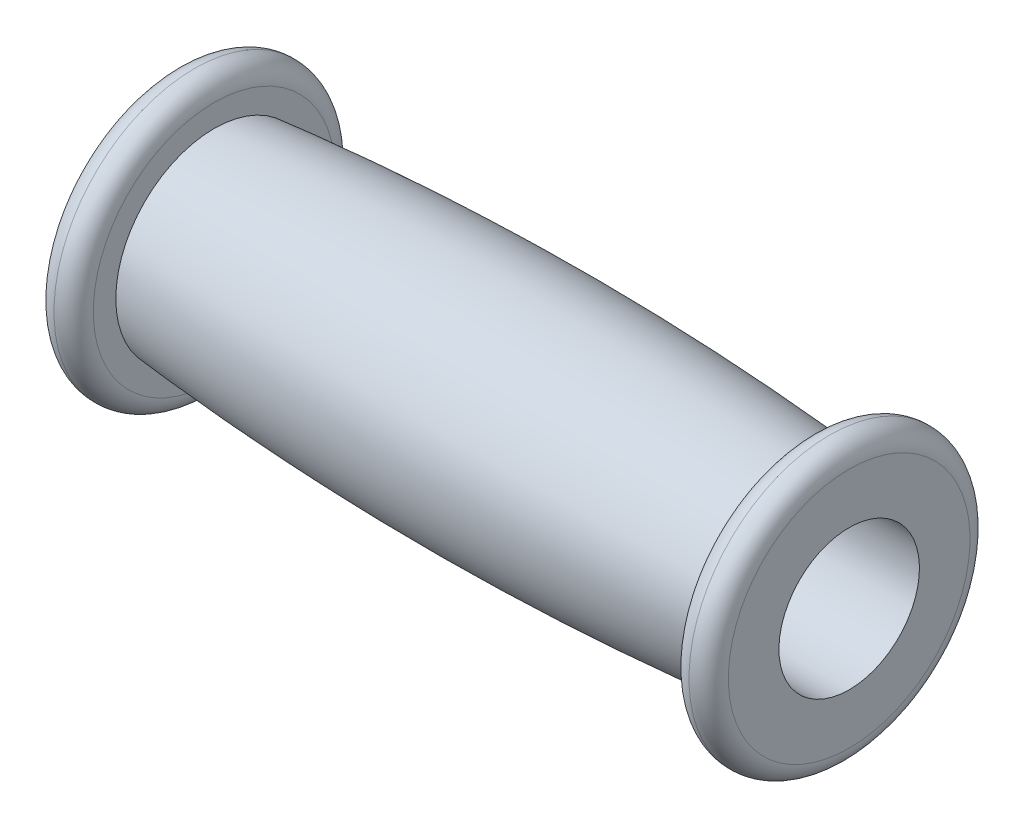
ISO-10303-21;
HEADER;
FILE_DESCRIPTION(('STEP AP214'),'2;1');
FILE_NAME('part.step','',(''),(''),'','','');
FILE_SCHEMA(('AUTOMOTIVE_DESIGN { 1 0 10303 214 1 1 1 1 }'));
ENDSEC;
DATA;
#1=APPLICATION_CONTEXT('core data for automotive mechanical design processes');
#2=APPLICATION_PROTOCOL_DEFINITION('international standard','automotive_design',2000,#1);
#3=PRODUCT_CONTEXT('',#1,'mechanical');
#4=PRODUCT('Part','Part','',(#3));
#5=PRODUCT_RELATED_PRODUCT_CATEGORY('part','',(#4));
#6=PRODUCT_DEFINITION_FORMATION('','',#4);
#7=PRODUCT_DEFINITION_CONTEXT('part definition',#1,'design');
#8=PRODUCT_DEFINITION('design','',#6,#7);
#9=PRODUCT_DEFINITION_SHAPE('','',#8);
#10=(LENGTH_UNIT() NAMED_UNIT(*) SI_UNIT(.MILLI.,.METRE.));
#11=(NAMED_UNIT(*) PLANE_ANGLE_UNIT() SI_UNIT($,.RADIAN.));
#12=(NAMED_UNIT(*) SI_UNIT($,.STERADIAN.) SOLID_ANGLE_UNIT());
#13=UNCERTAINTY_MEASURE_WITH_UNIT(LENGTH_MEASURE(1.E-05),#10,'distance_accuracy_value','');
#14=(GEOMETRIC_REPRESENTATION_CONTEXT(3) GLOBAL_UNCERTAINTY_ASSIGNED_CONTEXT((#13)) GLOBAL_UNIT_ASSIGNED_CONTEXT((#10,
#11,#12)) REPRESENTATION_CONTEXT('',''));
#15=CARTESIAN_POINT('',(0.,0.,0.));
#16=DIRECTION('',(0.,0.,1.));
#17=DIRECTION('',(1.,0.,0.));
#18=AXIS2_PLACEMENT_3D('',#15,#16,#17);
#19=CARTESIAN_POINT('',(120.,25.,0.));
#20=DIRECTION('',(1.,0.,0.));
#21=DIRECTION('',(0.,1.,0.));
#22=AXIS2_PLACEMENT_3D('',#19,#20,#21);
#23=PLANE('',#22);
#24=CARTESIAN_POINT('',(120.,0.,0.));
#25=DIRECTION('',(1.,0.,0.));
#26=DIRECTION('',(0.,1.,0.));
#27=AXIS2_PLACEMENT_3D('',#24,#25,#26);
#28=CIRCLE('',#27,21.5);
#29=CARTESIAN_POINT('',(120.,21.5,0.));
#30=VERTEX_POINT('',#29);
#31=EDGE_CURVE('E108',#30,#30,#28,.T.);
#32=ORIENTED_EDGE('',*,*,#31,.T.);
#33=EDGE_LOOP('',(#32));
#34=FACE_BOUND('',#33,.T.);
#35=CARTESIAN_POINT('',(120.,0.,0.));
#36=DIRECTION('',(-1.,0.,0.));
#37=DIRECTION('',(0.,-1.,0.));
#38=AXIS2_PLACEMENT_3D('',#35,#36,#37);
#39=CIRCLE('',#38,12.5);
#40=CARTESIAN_POINT('',(120.,-12.5,0.));
#41=VERTEX_POINT('',#40);
#42=EDGE_CURVE('E64',#41,#41,#39,.T.);
#43=ORIENTED_EDGE('',*,*,#42,.T.);
#44=EDGE_LOOP('',(#43));
#45=FACE_BOUND('',#44,.T.);
#46=ADVANCED_FACE('F37',(#34,#45),#23,.T.);
#47=CARTESIAN_POINT('',(113.,17.5,0.));
#48=DIRECTION('',(-1.,0.,0.));
#49=DIRECTION('',(0.,-1.,0.));
#50=AXIS2_PLACEMENT_3D('',#47,#48,#49);
#51=PLANE('',#50);
#52=CARTESIAN_POINT('',(113.,0.,0.));
#53=DIRECTION('',(-1.,0.,0.));
#54=DIRECTION('',(0.,-1.,0.));
#55=AXIS2_PLACEMENT_3D('',#52,#53,#54);
#56=CIRCLE('',#55,21.5);
#57=CARTESIAN_POINT('',(113.,-21.5,0.));
#58=VERTEX_POINT('',#57);
#59=EDGE_CURVE('E52',#58,#58,#56,.T.);
#60=ORIENTED_EDGE('',*,*,#59,.T.);
#61=EDGE_LOOP('',(#60));
#62=FACE_BOUND('',#61,.T.);
#63=CARTESIAN_POINT('',(113.,0.,0.));
#64=DIRECTION('',(1.,0.,0.));
#65=DIRECTION('',(0.,1.,0.));
#66=AXIS2_PLACEMENT_3D('',#63,#64,#65);
#67=CIRCLE('',#66,17.5);
#68=CARTESIAN_POINT('',(113.,17.5,0.));
#69=VERTEX_POINT('',#68);
#70=EDGE_CURVE('E110',#69,#69,#67,.T.);
#71=ORIENTED_EDGE('',*,*,#70,.T.);
#72=EDGE_LOOP('',(#71));
#73=FACE_BOUND('',#72,.T.);
#74=ADVANCED_FACE('F82',(#62,#73),#51,.T.);
#75=CARTESIAN_POINT('',(113.,17.5,0.));
#76=CARTESIAN_POINT('',(59.9994953827093,22.5000228886406,0.));
#77=CARTESIAN_POINT('',(6.99999999999999,17.5,0.));
#78=B_SPLINE_CURVE_WITH_KNOTS('',2,(#75,#76,#77),.UNSPECIFIED.,.F.,.F.,(3,3),(0.,1.),.UNSPECIFIED.);
#79=CARTESIAN_POINT('',(120.,0.,0.));
#80=DIRECTION('',(1.,0.,0.));
#81=AXIS1_PLACEMENT('',#79,#80);
#82=SURFACE_OF_REVOLUTION('',#78,#81);
#83=CARTESIAN_POINT('',(6.99999999999999,0.,0.));
#84=DIRECTION('',(1.,0.,0.));
#85=DIRECTION('',(0.,1.,0.));
#86=AXIS2_PLACEMENT_3D('',#83,#84,#85);
#87=CIRCLE('',#86,17.5);
#88=CARTESIAN_POINT('',(6.99999999999999,17.5,0.));
#89=VERTEX_POINT('',#88);
#90=EDGE_CURVE('E116',#89,#89,#87,.T.);
#91=ORIENTED_EDGE('',*,*,#90,.T.);
#92=EDGE_LOOP('',(#91));
#93=FACE_BOUND('',#92,.T.);
#94=ORIENTED_EDGE('',*,*,#70,.F.);
#95=EDGE_LOOP('',(#94));
#96=FACE_BOUND('',#95,.T.);
#97=ADVANCED_FACE('F88',(#93,#96),#82,.F.);
#98=CARTESIAN_POINT('',(6.99999999999999,25.,0.));
#99=DIRECTION('',(1.,0.,0.));
#100=DIRECTION('',(0.,1.,0.));
#101=AXIS2_PLACEMENT_3D('',#98,#99,#100);
#102=PLANE('',#101);
#103=CARTESIAN_POINT('',(6.99999999999999,0.,0.));
#104=DIRECTION('',(1.,0.,0.));
#105=DIRECTION('',(0.,1.,0.));
#106=AXIS2_PLACEMENT_3D('',#103,#104,#105);
#107=CIRCLE('',#106,21.5);
#108=CARTESIAN_POINT('',(6.99999999999999,21.5,0.));
#109=VERTEX_POINT('',#108);
#110=EDGE_CURVE('E46',#109,#109,#107,.T.);
#111=ORIENTED_EDGE('',*,*,#110,.T.);
#112=EDGE_LOOP('',(#111));
#113=FACE_BOUND('',#112,.T.);
#114=ORIENTED_EDGE('',*,*,#90,.F.);
#115=EDGE_LOOP('',(#114));
#116=FACE_BOUND('',#115,.T.);
#117=ADVANCED_FACE('F129',(#113,#116),#102,.T.);
#118=CARTESIAN_POINT('',(0.,0.,0.));
#119=DIRECTION('',(-1.,0.,0.));
#120=DIRECTION('',(0.,-1.,0.));
#121=AXIS2_PLACEMENT_3D('',#118,#119,#120);
#122=PLANE('',#121);
#123=CARTESIAN_POINT('',(0.,0.,0.));
#124=DIRECTION('',(-1.,0.,0.));
#125=DIRECTION('',(0.,-1.,0.));
#126=AXIS2_PLACEMENT_3D('',#123,#124,#125);
#127=CIRCLE('',#126,21.5);
#128=CARTESIAN_POINT('',(0.,-21.5,0.));
#129=VERTEX_POINT('',#128);
#130=EDGE_CURVE('E10',#129,#129,#127,.T.);
#131=ORIENTED_EDGE('',*,*,#130,.T.);
#132=EDGE_LOOP('',(#131));
#133=FACE_BOUND('',#132,.T.);
#134=CARTESIAN_POINT('',(0.,0.,0.));
#135=DIRECTION('',(-1.,0.,0.));
#136=DIRECTION('',(0.,-1.,0.));
#137=AXIS2_PLACEMENT_3D('',#134,#135,#136);
#138=CIRCLE('',#137,12.5);
#139=CARTESIAN_POINT('',(0.,-12.5,0.));
#140=VERTEX_POINT('',#139);
#141=EDGE_CURVE('E58',#140,#140,#138,.T.);
#142=ORIENTED_EDGE('',*,*,#141,.F.);
#143=EDGE_LOOP('',(#142));
#144=FACE_BOUND('',#143,.T.);
#145=ADVANCED_FACE('F101',(#133,#144),#122,.T.);
#146=CARTESIAN_POINT('',(120.,0.,0.));
#147=DIRECTION('',(-1.,0.,0.));
#148=DIRECTION('',(0.,-1.,0.));
#149=AXIS2_PLACEMENT_3D('',#146,#147,#148);
#150=CYLINDRICAL_SURFACE('',#149,12.5);
#151=ORIENTED_EDGE('',*,*,#42,.F.);
#152=EDGE_LOOP('',(#151));
#153=FACE_BOUND('',#152,.T.);
#154=ORIENTED_EDGE('',*,*,#141,.T.);
#155=EDGE_LOOP('',(#154));
#156=FACE_BOUND('',#155,.T.);
#157=ADVANCED_FACE('F96',(#153,#156),#150,.F.);
#158=CARTESIAN_POINT('',(116.5,0.,0.));
#159=DIRECTION('',(-1.,0.,0.));
#160=DIRECTION('',(0.,-1.,0.));
#161=AXIS2_PLACEMENT_3D('',#158,#159,#160);
#162=TOROIDAL_SURFACE('',#161,21.5,3.5);
#163=ORIENTED_EDGE('',*,*,#59,.F.);
#164=EDGE_LOOP('',(#163));
#165=FACE_BOUND('',#164,.T.);
#166=CARTESIAN_POINT('',(116.5,0.,0.));
#167=DIRECTION('',(-1.,0.,0.));
#168=DIRECTION('',(0.,-1.,0.));
#169=AXIS2_PLACEMENT_3D('',#166,#167,#168);
#170=CIRCLE('',#169,25.);
#171=CARTESIAN_POINT('',(116.5,-25.,0.));
#172=VERTEX_POINT('',#171);
#173=EDGE_CURVE('E55',#172,#172,#170,.F.);
#174=ORIENTED_EDGE('',*,*,#173,.F.);
#175=EDGE_LOOP('',(#174));
#176=FACE_BOUND('',#175,.T.);
#177=ADVANCED_FACE('F79',(#165,#176),#162,.T.);
#178=CARTESIAN_POINT('',(116.5,0.,0.));
#179=DIRECTION('',(1.,0.,0.));
#180=DIRECTION('',(0.,1.,0.));
#181=AXIS2_PLACEMENT_3D('',#178,#179,#180);
#182=TOROIDAL_SURFACE('',#181,21.5,3.5);
#183=ORIENTED_EDGE('',*,*,#173,.T.);
#184=EDGE_LOOP('',(#183));
#185=FACE_BOUND('',#184,.T.);
#186=ORIENTED_EDGE('',*,*,#31,.F.);
#187=EDGE_LOOP('',(#186));
#188=FACE_BOUND('',#187,.T.);
#189=ADVANCED_FACE('F73',(#185,#188),#182,.T.);
#190=CARTESIAN_POINT('',(3.5,0.,0.));
#191=DIRECTION('',(-1.,0.,0.));
#192=DIRECTION('',(0.,-1.,0.));
#193=AXIS2_PLACEMENT_3D('',#190,#191,#192);
#194=TOROIDAL_SURFACE('',#193,21.5,3.5);
#195=ORIENTED_EDGE('',*,*,#130,.F.);
#196=EDGE_LOOP('',(#195));
#197=FACE_BOUND('',#196,.T.);
#198=CARTESIAN_POINT('',(3.5,0.,0.));
#199=DIRECTION('',(-1.,0.,0.));
#200=DIRECTION('',(0.,-1.,0.));
#201=AXIS2_PLACEMENT_3D('',#198,#199,#200);
#202=CIRCLE('',#201,25.);
#203=CARTESIAN_POINT('',(3.5,-25.,0.));
#204=VERTEX_POINT('',#203);
#205=EDGE_CURVE('E41',#204,#204,#202,.F.);
#206=ORIENTED_EDGE('',*,*,#205,.F.);
#207=EDGE_LOOP('',(#206));
#208=FACE_BOUND('',#207,.T.);
#209=ADVANCED_FACE('F39',(#197,#208),#194,.T.);
#210=CARTESIAN_POINT('',(3.49999999999999,0.,0.));
#211=DIRECTION('',(1.,0.,0.));
#212=DIRECTION('',(0.,1.,0.));
#213=AXIS2_PLACEMENT_3D('',#210,#211,#212);
#214=TOROIDAL_SURFACE('',#213,21.5,3.5);
#215=ORIENTED_EDGE('',*,*,#205,.T.);
#216=EDGE_LOOP('',(#215));
#217=FACE_BOUND('',#216,.T.);
#218=ORIENTED_EDGE('',*,*,#110,.F.);
#219=EDGE_LOOP('',(#218));
#220=FACE_BOUND('',#219,.T.);
#221=ADVANCED_FACE('F69',(#217,#220),#214,.T.);
#222=CLOSED_SHELL('',(#46,#74,#97,#117,#145,#157,#177,#189,#209,#221));
#223=MANIFOLD_SOLID_BREP('B2',#222);
#224=ADVANCED_BREP_SHAPE_REPRESENTATION('',(#18,#223),#14);
#225=SHAPE_DEFINITION_REPRESENTATION(#9,#224);
ENDSEC;
END-ISO-10303-21;
